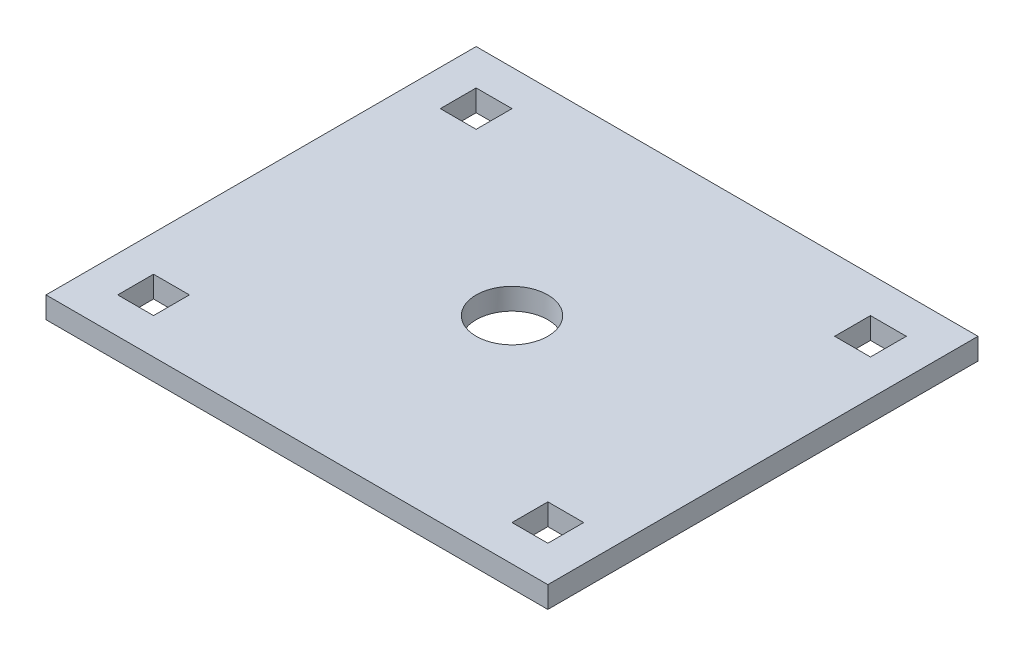
ISO-10303-21;
HEADER;
FILE_DESCRIPTION(('STEP AP214'),'2;1');
FILE_NAME('part.step','',(''),(''),'','','');
FILE_SCHEMA(('AUTOMOTIVE_DESIGN { 1 0 10303 214 1 1 1 1 }'));
ENDSEC;
DATA;
#1=APPLICATION_CONTEXT('core data for automotive mechanical design processes');
#2=APPLICATION_PROTOCOL_DEFINITION('international standard','automotive_design',2000,#1);
#3=PRODUCT_CONTEXT('',#1,'mechanical');
#4=PRODUCT('Part','Part','',(#3));
#5=PRODUCT_RELATED_PRODUCT_CATEGORY('part','',(#4));
#6=PRODUCT_DEFINITION_FORMATION('','',#4);
#7=PRODUCT_DEFINITION_CONTEXT('part definition',#1,'design');
#8=PRODUCT_DEFINITION('design','',#6,#7);
#9=PRODUCT_DEFINITION_SHAPE('','',#8);
#10=(LENGTH_UNIT() NAMED_UNIT(*) SI_UNIT(.MILLI.,.METRE.));
#11=(NAMED_UNIT(*) PLANE_ANGLE_UNIT() SI_UNIT($,.RADIAN.));
#12=(NAMED_UNIT(*) SI_UNIT($,.STERADIAN.) SOLID_ANGLE_UNIT());
#13=UNCERTAINTY_MEASURE_WITH_UNIT(LENGTH_MEASURE(1.E-05),#10,'distance_accuracy_value','');
#14=(GEOMETRIC_REPRESENTATION_CONTEXT(3) GLOBAL_UNCERTAINTY_ASSIGNED_CONTEXT((#13)) GLOBAL_UNIT_ASSIGNED_CONTEXT((#10,
#11,#12)) REPRESENTATION_CONTEXT('',''));
#15=CARTESIAN_POINT('',(0.,0.,0.));
#16=DIRECTION('',(0.,0.,1.));
#17=DIRECTION('',(1.,0.,0.));
#18=AXIS2_PLACEMENT_3D('',#15,#16,#17);
#19=CARTESIAN_POINT('',(88.9,7.62,76.2));
#20=DIRECTION('',(-1.,0.,0.));
#21=DIRECTION('',(0.,0.,1.));
#22=AXIS2_PLACEMENT_3D('',#19,#20,#21);
#23=PLANE('',#22);
#24=DIRECTION('',(0.,0.,-1.));
#25=VECTOR('',#24,1.);
#26=CARTESIAN_POINT('',(88.9,0.,76.2));
#27=LINE('',#26,#25);
#28=CARTESIAN_POINT('',(88.9,0.,76.2));
#29=VERTEX_POINT('',#28);
#30=CARTESIAN_POINT('',(88.9,0.,-76.2));
#31=VERTEX_POINT('',#30);
#32=EDGE_CURVE('E316',#29,#31,#27,.T.);
#33=ORIENTED_EDGE('',*,*,#32,.T.);
#34=DIRECTION('',(0.,-1.,0.));
#35=VECTOR('',#34,1.);
#36=CARTESIAN_POINT('',(88.9,7.62,-76.2));
#37=LINE('',#36,#35);
#38=CARTESIAN_POINT('',(88.9,7.62,-76.2));
#39=VERTEX_POINT('',#38);
#40=EDGE_CURVE('E11',#39,#31,#37,.T.);
#41=ORIENTED_EDGE('',*,*,#40,.F.);
#42=DIRECTION('',(0.,0.,-1.));
#43=VECTOR('',#42,1.);
#44=CARTESIAN_POINT('',(88.9,7.62,76.2));
#45=LINE('',#44,#43);
#46=CARTESIAN_POINT('',(88.9,7.62,76.2));
#47=VERTEX_POINT('',#46);
#48=EDGE_CURVE('E317',#47,#39,#45,.T.);
#49=ORIENTED_EDGE('',*,*,#48,.F.);
#50=DIRECTION('',(0.,-1.,0.));
#51=VECTOR('',#50,1.);
#52=CARTESIAN_POINT('',(88.9,7.62,76.2));
#53=LINE('',#52,#51);
#54=EDGE_CURVE('E327',#47,#29,#53,.T.);
#55=ORIENTED_EDGE('',*,*,#54,.T.);
#56=EDGE_LOOP('',(#33,#41,#49,#55));
#57=FACE_BOUND('',#56,.T.);
#58=ADVANCED_FACE('F39',(#57),#23,.F.);
#59=CARTESIAN_POINT('',(-88.9,7.62,-76.2));
#60=DIRECTION('',(0.,0.,1.));
#61=DIRECTION('',(1.,0.,0.));
#62=AXIS2_PLACEMENT_3D('',#59,#60,#61);
#63=PLANE('',#62);
#64=DIRECTION('',(-1.,0.,0.));
#65=VECTOR('',#64,1.);
#66=CARTESIAN_POINT('',(-88.9,0.,-76.2));
#67=LINE('',#66,#65);
#68=CARTESIAN_POINT('',(-88.9,0.,-76.2));
#69=VERTEX_POINT('',#68);
#70=EDGE_CURVE('E330',#31,#69,#67,.T.);
#71=ORIENTED_EDGE('',*,*,#70,.T.);
#72=DIRECTION('',(0.,-1.,0.));
#73=VECTOR('',#72,1.);
#74=CARTESIAN_POINT('',(-88.9,7.62,-76.2));
#75=LINE('',#74,#73);
#76=CARTESIAN_POINT('',(-88.9,7.62,-76.2));
#77=VERTEX_POINT('',#76);
#78=EDGE_CURVE('E46',#77,#69,#75,.T.);
#79=ORIENTED_EDGE('',*,*,#78,.F.);
#80=DIRECTION('',(-1.,0.,0.));
#81=VECTOR('',#80,1.);
#82=CARTESIAN_POINT('',(-88.9,7.62,-76.2));
#83=LINE('',#82,#81);
#84=EDGE_CURVE('E320',#39,#77,#83,.T.);
#85=ORIENTED_EDGE('',*,*,#84,.F.);
#86=ORIENTED_EDGE('',*,*,#40,.T.);
#87=EDGE_LOOP('',(#71,#79,#85,#86));
#88=FACE_BOUND('',#87,.T.);
#89=ADVANCED_FACE('F359',(#88),#63,.F.);
#90=CARTESIAN_POINT('',(-88.9,7.62,76.2));
#91=DIRECTION('',(1.,0.,0.));
#92=DIRECTION('',(0.,0.,-1.));
#93=AXIS2_PLACEMENT_3D('',#90,#91,#92);
#94=PLANE('',#93);
#95=DIRECTION('',(0.,0.,1.));
#96=VECTOR('',#95,1.);
#97=CARTESIAN_POINT('',(-88.9,0.,76.2));
#98=LINE('',#97,#96);
#99=CARTESIAN_POINT('',(-88.9,0.,76.2));
#100=VERTEX_POINT('',#99);
#101=EDGE_CURVE('E332',#69,#100,#98,.T.);
#102=ORIENTED_EDGE('',*,*,#101,.T.);
#103=DIRECTION('',(0.,-1.,0.));
#104=VECTOR('',#103,1.);
#105=CARTESIAN_POINT('',(-88.9,7.62,76.2));
#106=LINE('',#105,#104);
#107=CARTESIAN_POINT('',(-88.9,7.62,76.2));
#108=VERTEX_POINT('',#107);
#109=EDGE_CURVE('E337',#108,#100,#106,.T.);
#110=ORIENTED_EDGE('',*,*,#109,.F.);
#111=DIRECTION('',(0.,0.,1.));
#112=VECTOR('',#111,1.);
#113=CARTESIAN_POINT('',(-88.9,7.62,76.2));
#114=LINE('',#113,#112);
#115=EDGE_CURVE('E323',#77,#108,#114,.T.);
#116=ORIENTED_EDGE('',*,*,#115,.F.);
#117=ORIENTED_EDGE('',*,*,#78,.T.);
#118=EDGE_LOOP('',(#102,#110,#116,#117));
#119=FACE_BOUND('',#118,.T.);
#120=ADVANCED_FACE('F344',(#119),#94,.F.);
#121=CARTESIAN_POINT('',(-88.9,7.62,76.2));
#122=DIRECTION('',(0.,0.,-1.));
#123=DIRECTION('',(-1.,0.,0.));
#124=AXIS2_PLACEMENT_3D('',#121,#122,#123);
#125=PLANE('',#124);
#126=DIRECTION('',(1.,0.,0.));
#127=VECTOR('',#126,1.);
#128=CARTESIAN_POINT('',(-88.9,0.,76.2));
#129=LINE('',#128,#127);
#130=EDGE_CURVE('E321',#100,#29,#129,.T.);
#131=ORIENTED_EDGE('',*,*,#130,.T.);
#132=ORIENTED_EDGE('',*,*,#54,.F.);
#133=DIRECTION('',(1.,0.,0.));
#134=VECTOR('',#133,1.);
#135=CARTESIAN_POINT('',(-88.9,7.62,76.2));
#136=LINE('',#135,#134);
#137=EDGE_CURVE('E325',#108,#47,#136,.T.);
#138=ORIENTED_EDGE('',*,*,#137,.F.);
#139=ORIENTED_EDGE('',*,*,#109,.T.);
#140=EDGE_LOOP('',(#131,#132,#138,#139));
#141=FACE_BOUND('',#140,.T.);
#142=ADVANCED_FACE('F352',(#141),#125,.F.);
#143=CARTESIAN_POINT('',(0.,7.62,0.));
#144=DIRECTION('',(0.,-1.,0.));
#145=DIRECTION('',(0.,0.,-1.));
#146=AXIS2_PLACEMENT_3D('',#143,#144,#145);
#147=PLANE('',#146);
#148=DIRECTION('',(1.,0.,0.));
#149=VECTOR('',#148,1.);
#150=CARTESIAN_POINT('',(63.5,7.62,63.5));
#151=LINE('',#150,#149);
#152=CARTESIAN_POINT('',(63.5,7.62,63.5));
#153=VERTEX_POINT('',#152);
#154=CARTESIAN_POINT('',(76.2,7.62,63.5));
#155=VERTEX_POINT('',#154);
#156=EDGE_CURVE('E233',#153,#155,#151,.T.);
#157=ORIENTED_EDGE('',*,*,#156,.F.);
#158=DIRECTION('',(0.,0.,1.));
#159=VECTOR('',#158,1.);
#160=CARTESIAN_POINT('',(63.5,7.62,63.5));
#161=LINE('',#160,#159);
#162=CARTESIAN_POINT('',(63.5,7.62,50.8));
#163=VERTEX_POINT('',#162);
#164=EDGE_CURVE('E53',#163,#153,#161,.T.);
#165=ORIENTED_EDGE('',*,*,#164,.F.);
#166=DIRECTION('',(-1.,0.,0.));
#167=VECTOR('',#166,1.);
#168=CARTESIAN_POINT('',(63.5,7.62,50.8));
#169=LINE('',#168,#167);
#170=CARTESIAN_POINT('',(76.2,7.62,50.8));
#171=VERTEX_POINT('',#170);
#172=EDGE_CURVE('E222',#171,#163,#169,.T.);
#173=ORIENTED_EDGE('',*,*,#172,.F.);
#174=DIRECTION('',(0.,0.,-1.));
#175=VECTOR('',#174,1.);
#176=CARTESIAN_POINT('',(76.2,7.62,63.5));
#177=LINE('',#176,#175);
#178=EDGE_CURVE('E237',#155,#171,#177,.T.);
#179=ORIENTED_EDGE('',*,*,#178,.F.);
#180=EDGE_LOOP('',(#157,#165,#173,#179));
#181=FACE_BOUND('',#180,.T.);
#182=DIRECTION('',(1.,0.,0.));
#183=VECTOR('',#182,1.);
#184=CARTESIAN_POINT('',(-76.2,7.62,-50.8));
#185=LINE('',#184,#183);
#186=CARTESIAN_POINT('',(-76.2,7.62,-50.8));
#187=VERTEX_POINT('',#186);
#188=CARTESIAN_POINT('',(-63.5,7.62,-50.8000000000001));
#189=VERTEX_POINT('',#188);
#190=EDGE_CURVE('E265',#187,#189,#185,.T.);
#191=ORIENTED_EDGE('',*,*,#190,.F.);
#192=DIRECTION('',(0.,0.,1.));
#193=VECTOR('',#192,1.);
#194=CARTESIAN_POINT('',(-76.2,7.62,-63.5000000000001));
#195=LINE('',#194,#193);
#196=CARTESIAN_POINT('',(-76.2,7.62,-63.5000000000001));
#197=VERTEX_POINT('',#196);
#198=EDGE_CURVE('E61',#197,#187,#195,.T.);
#199=ORIENTED_EDGE('',*,*,#198,.F.);
#200=DIRECTION('',(-1.,0.,0.));
#201=VECTOR('',#200,1.);
#202=CARTESIAN_POINT('',(-76.2,7.62,-63.5000000000001));
#203=LINE('',#202,#201);
#204=CARTESIAN_POINT('',(-63.5,7.62,-63.5000000000001));
#205=VERTEX_POINT('',#204);
#206=EDGE_CURVE('E254',#205,#197,#203,.T.);
#207=ORIENTED_EDGE('',*,*,#206,.F.);
#208=DIRECTION('',(0.,0.,-1.));
#209=VECTOR('',#208,1.);
#210=CARTESIAN_POINT('',(-63.5,7.62,-63.5000000000001));
#211=LINE('',#210,#209);
#212=EDGE_CURVE('E268',#189,#205,#211,.T.);
#213=ORIENTED_EDGE('',*,*,#212,.F.);
#214=EDGE_LOOP('',(#191,#199,#207,#213));
#215=FACE_BOUND('',#214,.T.);
#216=DIRECTION('',(1.,0.,0.));
#217=VECTOR('',#216,1.);
#218=CARTESIAN_POINT('',(63.5,7.62,-50.8));
#219=LINE('',#218,#217);
#220=CARTESIAN_POINT('',(63.5,7.62,-50.8));
#221=VERTEX_POINT('',#220);
#222=CARTESIAN_POINT('',(76.2,7.62,-50.8));
#223=VERTEX_POINT('',#222);
#224=EDGE_CURVE('E209',#221,#223,#219,.T.);
#225=ORIENTED_EDGE('',*,*,#224,.F.);
#226=DIRECTION('',(0.,0.,1.));
#227=VECTOR('',#226,1.);
#228=CARTESIAN_POINT('',(63.5,7.62,-63.5));
#229=LINE('',#228,#227);
#230=CARTESIAN_POINT('',(63.5,7.62,-63.5));
#231=VERTEX_POINT('',#230);
#232=EDGE_CURVE('E182',#231,#221,#229,.T.);
#233=ORIENTED_EDGE('',*,*,#232,.F.);
#234=DIRECTION('',(-1.,0.,0.));
#235=VECTOR('',#234,1.);
#236=CARTESIAN_POINT('',(63.5,7.62,-63.5));
#237=LINE('',#236,#235);
#238=CARTESIAN_POINT('',(76.2,7.62,-63.5));
#239=VERTEX_POINT('',#238);
#240=EDGE_CURVE('E200',#239,#231,#237,.T.);
#241=ORIENTED_EDGE('',*,*,#240,.F.);
#242=DIRECTION('',(0.,0.,-1.));
#243=VECTOR('',#242,1.);
#244=CARTESIAN_POINT('',(76.2,7.62,-63.5));
#245=LINE('',#244,#243);
#246=EDGE_CURVE('E203',#223,#239,#245,.T.);
#247=ORIENTED_EDGE('',*,*,#246,.F.);
#248=EDGE_LOOP('',(#225,#233,#241,#247));
#249=FACE_BOUND('',#248,.T.);
#250=DIRECTION('',(1.,0.,0.));
#251=VECTOR('',#250,1.);
#252=CARTESIAN_POINT('',(-76.2,7.62,63.5));
#253=LINE('',#252,#251);
#254=CARTESIAN_POINT('',(-76.2,7.62,63.5));
#255=VERTEX_POINT('',#254);
#256=CARTESIAN_POINT('',(-63.5,7.62,63.4999999999999));
#257=VERTEX_POINT('',#256);
#258=EDGE_CURVE('E294',#255,#257,#253,.T.);
#259=ORIENTED_EDGE('',*,*,#258,.F.);
#260=DIRECTION('',(0.,0.,1.));
#261=VECTOR('',#260,1.);
#262=CARTESIAN_POINT('',(-76.2,7.62,63.5));
#263=LINE('',#262,#261);
#264=CARTESIAN_POINT('',(-76.2,7.62,50.8));
#265=VERTEX_POINT('',#264);
#266=EDGE_CURVE('E244',#265,#255,#263,.T.);
#267=ORIENTED_EDGE('',*,*,#266,.F.);
#268=DIRECTION('',(-1.,0.,0.));
#269=VECTOR('',#268,1.);
#270=CARTESIAN_POINT('',(-76.2,7.62,50.8));
#271=LINE('',#270,#269);
#272=CARTESIAN_POINT('',(-63.5,7.62,50.8));
#273=VERTEX_POINT('',#272);
#274=EDGE_CURVE('E283',#273,#265,#271,.T.);
#275=ORIENTED_EDGE('',*,*,#274,.F.);
#276=DIRECTION('',(0.,0.,-1.));
#277=VECTOR('',#276,1.);
#278=CARTESIAN_POINT('',(-63.5,7.62,63.4999999999999));
#279=LINE('',#278,#277);
#280=EDGE_CURVE('E297',#257,#273,#279,.T.);
#281=ORIENTED_EDGE('',*,*,#280,.F.);
#282=EDGE_LOOP('',(#259,#267,#275,#281));
#283=FACE_BOUND('',#282,.T.);
#284=CARTESIAN_POINT('',(0.,7.62,0.));
#285=DIRECTION('',(0.,1.,0.));
#286=DIRECTION('',(0.,0.,1.));
#287=AXIS2_PLACEMENT_3D('',#284,#285,#286);
#288=CIRCLE('',#287,12.7);
#289=CARTESIAN_POINT('',(0.,7.62,12.7));
#290=VERTEX_POINT('',#289);
#291=EDGE_CURVE('E304',#290,#290,#288,.T.);
#292=ORIENTED_EDGE('',*,*,#291,.F.);
#293=EDGE_LOOP('',(#292));
#294=FACE_BOUND('',#293,.T.);
#295=ORIENTED_EDGE('',*,*,#48,.T.);
#296=ORIENTED_EDGE('',*,*,#84,.T.);
#297=ORIENTED_EDGE('',*,*,#115,.T.);
#298=ORIENTED_EDGE('',*,*,#137,.T.);
#299=EDGE_LOOP('',(#295,#296,#297,#298));
#300=FACE_BOUND('',#299,.T.);
#301=ADVANCED_FACE('F358',(#181,#215,#249,#283,#294,#300),#147,.F.);
#302=CARTESIAN_POINT('',(0.,0.,0.));
#303=DIRECTION('',(0.,-1.,0.));
#304=DIRECTION('',(0.,0.,-1.));
#305=AXIS2_PLACEMENT_3D('',#302,#303,#304);
#306=PLANE('',#305);
#307=DIRECTION('',(0.,0.,1.));
#308=VECTOR('',#307,1.);
#309=CARTESIAN_POINT('',(63.5,0.,63.5));
#310=LINE('',#309,#308);
#311=CARTESIAN_POINT('',(63.5,0.,50.8));
#312=VERTEX_POINT('',#311);
#313=CARTESIAN_POINT('',(63.5,0.,63.5));
#314=VERTEX_POINT('',#313);
#315=EDGE_CURVE('E218',#312,#314,#310,.T.);
#316=ORIENTED_EDGE('',*,*,#315,.T.);
#317=DIRECTION('',(1.,0.,0.));
#318=VECTOR('',#317,1.);
#319=CARTESIAN_POINT('',(63.5,0.,63.5));
#320=LINE('',#319,#318);
#321=CARTESIAN_POINT('',(76.2,0.,63.5));
#322=VERTEX_POINT('',#321);
#323=EDGE_CURVE('E221',#314,#322,#320,.T.);
#324=ORIENTED_EDGE('',*,*,#323,.T.);
#325=DIRECTION('',(0.,0.,-1.));
#326=VECTOR('',#325,1.);
#327=CARTESIAN_POINT('',(76.2,0.,63.5));
#328=LINE('',#327,#326);
#329=CARTESIAN_POINT('',(76.2,0.,50.8));
#330=VERTEX_POINT('',#329);
#331=EDGE_CURVE('E225',#322,#330,#328,.T.);
#332=ORIENTED_EDGE('',*,*,#331,.T.);
#333=DIRECTION('',(-1.,0.,0.));
#334=VECTOR('',#333,1.);
#335=CARTESIAN_POINT('',(63.5,0.,50.8));
#336=LINE('',#335,#334);
#337=EDGE_CURVE('E228',#330,#312,#336,.T.);
#338=ORIENTED_EDGE('',*,*,#337,.T.);
#339=EDGE_LOOP('',(#316,#324,#332,#338));
#340=FACE_BOUND('',#339,.T.);
#341=DIRECTION('',(0.,0.,1.));
#342=VECTOR('',#341,1.);
#343=CARTESIAN_POINT('',(-76.2,0.,-63.5000000000001));
#344=LINE('',#343,#342);
#345=CARTESIAN_POINT('',(-76.2,0.,-63.5000000000001));
#346=VERTEX_POINT('',#345);
#347=CARTESIAN_POINT('',(-76.2,0.,-50.8));
#348=VERTEX_POINT('',#347);
#349=EDGE_CURVE('E250',#346,#348,#344,.T.);
#350=ORIENTED_EDGE('',*,*,#349,.T.);
#351=DIRECTION('',(1.,0.,0.));
#352=VECTOR('',#351,1.);
#353=CARTESIAN_POINT('',(-76.2,0.,-50.8));
#354=LINE('',#353,#352);
#355=CARTESIAN_POINT('',(-63.5,0.,-50.8000000000001));
#356=VERTEX_POINT('',#355);
#357=EDGE_CURVE('E253',#348,#356,#354,.T.);
#358=ORIENTED_EDGE('',*,*,#357,.T.);
#359=DIRECTION('',(0.,0.,-1.));
#360=VECTOR('',#359,1.);
#361=CARTESIAN_POINT('',(-63.5,0.,-63.5000000000001));
#362=LINE('',#361,#360);
#363=CARTESIAN_POINT('',(-63.5,0.,-63.5000000000001));
#364=VERTEX_POINT('',#363);
#365=EDGE_CURVE('E257',#356,#364,#362,.T.);
#366=ORIENTED_EDGE('',*,*,#365,.T.);
#367=DIRECTION('',(-1.,0.,0.));
#368=VECTOR('',#367,1.);
#369=CARTESIAN_POINT('',(-76.2,0.,-63.5000000000001));
#370=LINE('',#369,#368);
#371=EDGE_CURVE('E260',#364,#346,#370,.T.);
#372=ORIENTED_EDGE('',*,*,#371,.T.);
#373=EDGE_LOOP('',(#350,#358,#366,#372));
#374=FACE_BOUND('',#373,.T.);
#375=DIRECTION('',(0.,0.,1.));
#376=VECTOR('',#375,1.);
#377=CARTESIAN_POINT('',(63.5,0.,-63.5));
#378=LINE('',#377,#376);
#379=CARTESIAN_POINT('',(63.5,0.,-63.5));
#380=VERTEX_POINT('',#379);
#381=CARTESIAN_POINT('',(63.5,0.,-50.8));
#382=VERTEX_POINT('',#381);
#383=EDGE_CURVE('E179',#380,#382,#378,.T.);
#384=ORIENTED_EDGE('',*,*,#383,.T.);
#385=DIRECTION('',(1.,0.,0.));
#386=VECTOR('',#385,1.);
#387=CARTESIAN_POINT('',(63.5,0.,-50.8));
#388=LINE('',#387,#386);
#389=CARTESIAN_POINT('',(76.2,0.,-50.8));
#390=VERTEX_POINT('',#389);
#391=EDGE_CURVE('E191',#382,#390,#388,.T.);
#392=ORIENTED_EDGE('',*,*,#391,.T.);
#393=DIRECTION('',(0.,0.,-1.));
#394=VECTOR('',#393,1.);
#395=CARTESIAN_POINT('',(76.2,0.,-63.5));
#396=LINE('',#395,#394);
#397=CARTESIAN_POINT('',(76.2,0.,-63.5));
#398=VERTEX_POINT('',#397);
#399=EDGE_CURVE('E195',#390,#398,#396,.T.);
#400=ORIENTED_EDGE('',*,*,#399,.T.);
#401=DIRECTION('',(-1.,0.,0.));
#402=VECTOR('',#401,1.);
#403=CARTESIAN_POINT('',(63.5,0.,-63.5));
#404=LINE('',#403,#402);
#405=EDGE_CURVE('E187',#398,#380,#404,.T.);
#406=ORIENTED_EDGE('',*,*,#405,.T.);
#407=EDGE_LOOP('',(#384,#392,#400,#406));
#408=FACE_BOUND('',#407,.T.);
#409=DIRECTION('',(0.,0.,1.));
#410=VECTOR('',#409,1.);
#411=CARTESIAN_POINT('',(-76.2,0.,63.5));
#412=LINE('',#411,#410);
#413=CARTESIAN_POINT('',(-76.2,0.,50.8));
#414=VERTEX_POINT('',#413);
#415=CARTESIAN_POINT('',(-76.2,0.,63.5));
#416=VERTEX_POINT('',#415);
#417=EDGE_CURVE('E279',#414,#416,#412,.T.);
#418=ORIENTED_EDGE('',*,*,#417,.T.);
#419=DIRECTION('',(1.,0.,0.));
#420=VECTOR('',#419,1.);
#421=CARTESIAN_POINT('',(-76.2,0.,63.5));
#422=LINE('',#421,#420);
#423=CARTESIAN_POINT('',(-63.5,0.,63.4999999999999));
#424=VERTEX_POINT('',#423);
#425=EDGE_CURVE('E282',#416,#424,#422,.T.);
#426=ORIENTED_EDGE('',*,*,#425,.T.);
#427=DIRECTION('',(0.,0.,-1.));
#428=VECTOR('',#427,1.);
#429=CARTESIAN_POINT('',(-63.5,0.,63.4999999999999));
#430=LINE('',#429,#428);
#431=CARTESIAN_POINT('',(-63.5,0.,50.8));
#432=VERTEX_POINT('',#431);
#433=EDGE_CURVE('E286',#424,#432,#430,.T.);
#434=ORIENTED_EDGE('',*,*,#433,.T.);
#435=DIRECTION('',(-1.,0.,0.));
#436=VECTOR('',#435,1.);
#437=CARTESIAN_POINT('',(-76.2,0.,50.8));
#438=LINE('',#437,#436);
#439=EDGE_CURVE('E289',#432,#414,#438,.T.);
#440=ORIENTED_EDGE('',*,*,#439,.T.);
#441=EDGE_LOOP('',(#418,#426,#434,#440));
#442=FACE_BOUND('',#441,.T.);
#443=CARTESIAN_POINT('',(0.,0.,0.));
#444=DIRECTION('',(0.,-1.,0.));
#445=DIRECTION('',(0.,0.,-1.));
#446=AXIS2_PLACEMENT_3D('',#443,#444,#445);
#447=CIRCLE('',#446,12.7);
#448=CARTESIAN_POINT('',(0.,0.,-12.7));
#449=VERTEX_POINT('',#448);
#450=EDGE_CURVE('E313',#449,#449,#447,.F.);
#451=ORIENTED_EDGE('',*,*,#450,.T.);
#452=EDGE_LOOP('',(#451));
#453=FACE_BOUND('',#452,.T.);
#454=ORIENTED_EDGE('',*,*,#32,.F.);
#455=ORIENTED_EDGE('',*,*,#130,.F.);
#456=ORIENTED_EDGE('',*,*,#101,.F.);
#457=ORIENTED_EDGE('',*,*,#70,.F.);
#458=EDGE_LOOP('',(#454,#455,#456,#457));
#459=FACE_BOUND('',#458,.T.);
#460=ADVANCED_FACE('F197',(#340,#374,#408,#442,#453,#459),#306,.T.);
#461=CARTESIAN_POINT('',(0.,-35.9210244842766,0.));
#462=DIRECTION('',(0.,1.,0.));
#463=DIRECTION('',(0.,0.,1.));
#464=AXIS2_PLACEMENT_3D('',#461,#462,#463);
#465=CYLINDRICAL_SURFACE('',#464,12.7);
#466=ORIENTED_EDGE('',*,*,#291,.T.);
#467=EDGE_LOOP('',(#466));
#468=FACE_BOUND('',#467,.T.);
#469=ORIENTED_EDGE('',*,*,#450,.F.);
#470=EDGE_LOOP('',(#469));
#471=FACE_BOUND('',#470,.T.);
#472=ADVANCED_FACE('F371',(#468,#471),#465,.F.);
#473=CARTESIAN_POINT('',(-76.2,0.,63.5));
#474=DIRECTION('',(-1.,0.,0.));
#475=DIRECTION('',(0.,0.,1.));
#476=AXIS2_PLACEMENT_3D('',#473,#474,#475);
#477=PLANE('',#476);
#478=ORIENTED_EDGE('',*,*,#266,.T.);
#479=DIRECTION('',(0.,1.,0.));
#480=VECTOR('',#479,1.);
#481=CARTESIAN_POINT('',(-76.2,0.,63.5));
#482=LINE('',#481,#480);
#483=EDGE_CURVE('E292',#416,#255,#482,.T.);
#484=ORIENTED_EDGE('',*,*,#483,.F.);
#485=ORIENTED_EDGE('',*,*,#417,.F.);
#486=DIRECTION('',(0.,1.,0.));
#487=VECTOR('',#486,1.);
#488=CARTESIAN_POINT('',(-76.2,0.,50.8));
#489=LINE('',#488,#487);
#490=EDGE_CURVE('E302',#414,#265,#489,.T.);
#491=ORIENTED_EDGE('',*,*,#490,.T.);
#492=EDGE_LOOP('',(#478,#484,#485,#491));
#493=FACE_BOUND('',#492,.T.);
#494=ADVANCED_FACE('F378',(#493),#477,.F.);
#495=CARTESIAN_POINT('',(-76.2,0.,50.8));
#496=DIRECTION('',(0.,0.,-1.));
#497=DIRECTION('',(-1.,0.,0.));
#498=AXIS2_PLACEMENT_3D('',#495,#496,#497);
#499=PLANE('',#498);
#500=ORIENTED_EDGE('',*,*,#274,.T.);
#501=ORIENTED_EDGE('',*,*,#490,.F.);
#502=ORIENTED_EDGE('',*,*,#439,.F.);
#503=DIRECTION('',(0.,1.,0.));
#504=VECTOR('',#503,1.);
#505=CARTESIAN_POINT('',(-63.5,0.,50.8));
#506=LINE('',#505,#504);
#507=EDGE_CURVE('E305',#432,#273,#506,.T.);
#508=ORIENTED_EDGE('',*,*,#507,.T.);
#509=EDGE_LOOP('',(#500,#501,#502,#508));
#510=FACE_BOUND('',#509,.T.);
#511=ADVANCED_FACE('F382',(#510),#499,.F.);
#512=CARTESIAN_POINT('',(-63.5,0.,63.4999999999999));
#513=DIRECTION('',(1.,0.,0.));
#514=DIRECTION('',(0.,0.,-1.));
#515=AXIS2_PLACEMENT_3D('',#512,#513,#514);
#516=PLANE('',#515);
#517=ORIENTED_EDGE('',*,*,#280,.T.);
#518=ORIENTED_EDGE('',*,*,#507,.F.);
#519=ORIENTED_EDGE('',*,*,#433,.F.);
#520=DIRECTION('',(0.,1.,0.));
#521=VECTOR('',#520,1.);
#522=CARTESIAN_POINT('',(-63.5,0.,63.4999999999999));
#523=LINE('',#522,#521);
#524=EDGE_CURVE('E307',#424,#257,#523,.T.);
#525=ORIENTED_EDGE('',*,*,#524,.T.);
#526=EDGE_LOOP('',(#517,#518,#519,#525));
#527=FACE_BOUND('',#526,.T.);
#528=ADVANCED_FACE('F387',(#527),#516,.F.);
#529=CARTESIAN_POINT('',(-76.2,0.,63.5));
#530=DIRECTION('',(0.,0.,1.));
#531=DIRECTION('',(1.,0.,0.));
#532=AXIS2_PLACEMENT_3D('',#529,#530,#531);
#533=PLANE('',#532);
#534=ORIENTED_EDGE('',*,*,#258,.T.);
#535=ORIENTED_EDGE('',*,*,#524,.F.);
#536=ORIENTED_EDGE('',*,*,#425,.F.);
#537=ORIENTED_EDGE('',*,*,#483,.T.);
#538=EDGE_LOOP('',(#534,#535,#536,#537));
#539=FACE_BOUND('',#538,.T.);
#540=ADVANCED_FACE('F384',(#539),#533,.F.);
#541=CARTESIAN_POINT('',(63.5,0.,-63.5));
#542=DIRECTION('',(-1.,0.,0.));
#543=DIRECTION('',(0.,0.,1.));
#544=AXIS2_PLACEMENT_3D('',#541,#542,#543);
#545=PLANE('',#544);
#546=ORIENTED_EDGE('',*,*,#232,.T.);
#547=DIRECTION('',(0.,1.,0.));
#548=VECTOR('',#547,1.);
#549=CARTESIAN_POINT('',(63.5,0.,-50.8));
#550=LINE('',#549,#548);
#551=EDGE_CURVE('E175',#382,#221,#550,.T.);
#552=ORIENTED_EDGE('',*,*,#551,.F.);
#553=ORIENTED_EDGE('',*,*,#383,.F.);
#554=DIRECTION('',(0.,1.,0.));
#555=VECTOR('',#554,1.);
#556=CARTESIAN_POINT('',(63.5,0.,-63.5));
#557=LINE('',#556,#555);
#558=EDGE_CURVE('E213',#380,#231,#557,.T.);
#559=ORIENTED_EDGE('',*,*,#558,.T.);
#560=EDGE_LOOP('',(#546,#552,#553,#559));
#561=FACE_BOUND('',#560,.T.);
#562=ADVANCED_FACE('F177',(#561),#545,.F.);
#563=CARTESIAN_POINT('',(63.5,0.,-63.5));
#564=DIRECTION('',(0.,0.,-1.));
#565=DIRECTION('',(-1.,0.,0.));
#566=AXIS2_PLACEMENT_3D('',#563,#564,#565);
#567=PLANE('',#566);
#568=ORIENTED_EDGE('',*,*,#240,.T.);
#569=ORIENTED_EDGE('',*,*,#558,.F.);
#570=ORIENTED_EDGE('',*,*,#405,.F.);
#571=DIRECTION('',(0.,1.,0.));
#572=VECTOR('',#571,1.);
#573=CARTESIAN_POINT('',(76.2,0.,-63.5));
#574=LINE('',#573,#572);
#575=EDGE_CURVE('E215',#398,#239,#574,.T.);
#576=ORIENTED_EDGE('',*,*,#575,.T.);
#577=EDGE_LOOP('',(#568,#569,#570,#576));
#578=FACE_BOUND('',#577,.T.);
#579=ADVANCED_FACE('F427',(#578),#567,.F.);
#580=CARTESIAN_POINT('',(76.2,0.,-63.5));
#581=DIRECTION('',(1.,0.,0.));
#582=DIRECTION('',(0.,0.,-1.));
#583=AXIS2_PLACEMENT_3D('',#580,#581,#582);
#584=PLANE('',#583);
#585=ORIENTED_EDGE('',*,*,#246,.T.);
#586=ORIENTED_EDGE('',*,*,#575,.F.);
#587=ORIENTED_EDGE('',*,*,#399,.F.);
#588=DIRECTION('',(0.,1.,0.));
#589=VECTOR('',#588,1.);
#590=CARTESIAN_POINT('',(76.2,0.,-50.8));
#591=LINE('',#590,#589);
#592=EDGE_CURVE('E186',#390,#223,#591,.T.);
#593=ORIENTED_EDGE('',*,*,#592,.T.);
#594=EDGE_LOOP('',(#585,#586,#587,#593));
#595=FACE_BOUND('',#594,.T.);
#596=ADVANCED_FACE('F430',(#595),#584,.F.);
#597=CARTESIAN_POINT('',(63.5,0.,-50.8));
#598=DIRECTION('',(0.,0.,1.));
#599=DIRECTION('',(1.,0.,0.));
#600=AXIS2_PLACEMENT_3D('',#597,#598,#599);
#601=PLANE('',#600);
#602=ORIENTED_EDGE('',*,*,#224,.T.);
#603=ORIENTED_EDGE('',*,*,#592,.F.);
#604=ORIENTED_EDGE('',*,*,#391,.F.);
#605=ORIENTED_EDGE('',*,*,#551,.T.);
#606=EDGE_LOOP('',(#602,#603,#604,#605));
#607=FACE_BOUND('',#606,.T.);
#608=ADVANCED_FACE('F192',(#607),#601,.F.);
#609=CARTESIAN_POINT('',(-76.2,0.,-63.5000000000001));
#610=DIRECTION('',(-1.,0.,0.));
#611=DIRECTION('',(0.,0.,1.));
#612=AXIS2_PLACEMENT_3D('',#609,#610,#611);
#613=PLANE('',#612);
#614=ORIENTED_EDGE('',*,*,#198,.T.);
#615=DIRECTION('',(0.,1.,0.));
#616=VECTOR('',#615,1.);
#617=CARTESIAN_POINT('',(-76.2,0.,-50.8));
#618=LINE('',#617,#616);
#619=EDGE_CURVE('E263',#348,#187,#618,.T.);
#620=ORIENTED_EDGE('',*,*,#619,.F.);
#621=ORIENTED_EDGE('',*,*,#349,.F.);
#622=DIRECTION('',(0.,1.,0.));
#623=VECTOR('',#622,1.);
#624=CARTESIAN_POINT('',(-76.2,0.,-63.5000000000001));
#625=LINE('',#624,#623);
#626=EDGE_CURVE('E234',#346,#197,#625,.T.);
#627=ORIENTED_EDGE('',*,*,#626,.T.);
#628=EDGE_LOOP('',(#614,#620,#621,#627));
#629=FACE_BOUND('',#628,.T.);
#630=ADVANCED_FACE('F395',(#629),#613,.F.);
#631=CARTESIAN_POINT('',(-76.2,0.,-63.5000000000001));
#632=DIRECTION('',(0.,0.,-1.));
#633=DIRECTION('',(-1.,0.,0.));
#634=AXIS2_PLACEMENT_3D('',#631,#632,#633);
#635=PLANE('',#634);
#636=ORIENTED_EDGE('',*,*,#206,.T.);
#637=ORIENTED_EDGE('',*,*,#626,.F.);
#638=ORIENTED_EDGE('',*,*,#371,.F.);
#639=DIRECTION('',(0.,1.,0.));
#640=VECTOR('',#639,1.);
#641=CARTESIAN_POINT('',(-63.5,0.,-63.5000000000001));
#642=LINE('',#641,#640);
#643=EDGE_CURVE('E274',#364,#205,#642,.T.);
#644=ORIENTED_EDGE('',*,*,#643,.T.);
#645=EDGE_LOOP('',(#636,#637,#638,#644));
#646=FACE_BOUND('',#645,.T.);
#647=ADVANCED_FACE('F398',(#646),#635,.F.);
#648=CARTESIAN_POINT('',(-63.5,0.,-63.5000000000001));
#649=DIRECTION('',(1.,0.,0.));
#650=DIRECTION('',(0.,0.,-1.));
#651=AXIS2_PLACEMENT_3D('',#648,#649,#650);
#652=PLANE('',#651);
#653=ORIENTED_EDGE('',*,*,#212,.T.);
#654=ORIENTED_EDGE('',*,*,#643,.F.);
#655=ORIENTED_EDGE('',*,*,#365,.F.);
#656=DIRECTION('',(0.,1.,0.));
#657=VECTOR('',#656,1.);
#658=CARTESIAN_POINT('',(-63.5,0.,-50.8000000000001));
#659=LINE('',#658,#657);
#660=EDGE_CURVE('E276',#356,#189,#659,.T.);
#661=ORIENTED_EDGE('',*,*,#660,.T.);
#662=EDGE_LOOP('',(#653,#654,#655,#661));
#663=FACE_BOUND('',#662,.T.);
#664=ADVANCED_FACE('F403',(#663),#652,.F.);
#665=CARTESIAN_POINT('',(-76.2,0.,-50.8));
#666=DIRECTION('',(0.,0.,1.));
#667=DIRECTION('',(1.,0.,0.));
#668=AXIS2_PLACEMENT_3D('',#665,#666,#667);
#669=PLANE('',#668);
#670=ORIENTED_EDGE('',*,*,#190,.T.);
#671=ORIENTED_EDGE('',*,*,#660,.F.);
#672=ORIENTED_EDGE('',*,*,#357,.F.);
#673=ORIENTED_EDGE('',*,*,#619,.T.);
#674=EDGE_LOOP('',(#670,#671,#672,#673));
#675=FACE_BOUND('',#674,.T.);
#676=ADVANCED_FACE('F399',(#675),#669,.F.);
#677=CARTESIAN_POINT('',(63.5,0.,63.5));
#678=DIRECTION('',(-1.,0.,0.));
#679=DIRECTION('',(0.,0.,1.));
#680=AXIS2_PLACEMENT_3D('',#677,#678,#679);
#681=PLANE('',#680);
#682=ORIENTED_EDGE('',*,*,#164,.T.);
#683=DIRECTION('',(0.,1.,0.));
#684=VECTOR('',#683,1.);
#685=CARTESIAN_POINT('',(63.5,0.,63.5));
#686=LINE('',#685,#684);
#687=EDGE_CURVE('E231',#314,#153,#686,.T.);
#688=ORIENTED_EDGE('',*,*,#687,.F.);
#689=ORIENTED_EDGE('',*,*,#315,.F.);
#690=DIRECTION('',(0.,1.,0.));
#691=VECTOR('',#690,1.);
#692=CARTESIAN_POINT('',(63.5,0.,50.8));
#693=LINE('',#692,#691);
#694=EDGE_CURVE('E242',#312,#163,#693,.T.);
#695=ORIENTED_EDGE('',*,*,#694,.T.);
#696=EDGE_LOOP('',(#682,#688,#689,#695));
#697=FACE_BOUND('',#696,.T.);
#698=ADVANCED_FACE('F402',(#697),#681,.F.);
#699=CARTESIAN_POINT('',(63.5,0.,50.8));
#700=DIRECTION('',(0.,0.,-1.));
#701=DIRECTION('',(-1.,0.,0.));
#702=AXIS2_PLACEMENT_3D('',#699,#700,#701);
#703=PLANE('',#702);
#704=ORIENTED_EDGE('',*,*,#172,.T.);
#705=ORIENTED_EDGE('',*,*,#694,.F.);
#706=ORIENTED_EDGE('',*,*,#337,.F.);
#707=DIRECTION('',(0.,1.,0.));
#708=VECTOR('',#707,1.);
#709=CARTESIAN_POINT('',(76.2,0.,50.8));
#710=LINE('',#709,#708);
#711=EDGE_CURVE('E245',#330,#171,#710,.T.);
#712=ORIENTED_EDGE('',*,*,#711,.T.);
#713=EDGE_LOOP('',(#704,#705,#706,#712));
#714=FACE_BOUND('',#713,.T.);
#715=ADVANCED_FACE('F413',(#714),#703,.F.);
#716=CARTESIAN_POINT('',(76.2,0.,63.5));
#717=DIRECTION('',(1.,0.,0.));
#718=DIRECTION('',(0.,0.,-1.));
#719=AXIS2_PLACEMENT_3D('',#716,#717,#718);
#720=PLANE('',#719);
#721=ORIENTED_EDGE('',*,*,#178,.T.);
#722=ORIENTED_EDGE('',*,*,#711,.F.);
#723=ORIENTED_EDGE('',*,*,#331,.F.);
#724=DIRECTION('',(0.,1.,0.));
#725=VECTOR('',#724,1.);
#726=CARTESIAN_POINT('',(76.2,0.,63.5));
#727=LINE('',#726,#725);
#728=EDGE_CURVE('E247',#322,#155,#727,.T.);
#729=ORIENTED_EDGE('',*,*,#728,.T.);
#730=EDGE_LOOP('',(#721,#722,#723,#729));
#731=FACE_BOUND('',#730,.T.);
#732=ADVANCED_FACE('F417',(#731),#720,.F.);
#733=CARTESIAN_POINT('',(63.5,0.,63.5));
#734=DIRECTION('',(0.,0.,1.));
#735=DIRECTION('',(1.,0.,0.));
#736=AXIS2_PLACEMENT_3D('',#733,#734,#735);
#737=PLANE('',#736);
#738=ORIENTED_EDGE('',*,*,#156,.T.);
#739=ORIENTED_EDGE('',*,*,#728,.F.);
#740=ORIENTED_EDGE('',*,*,#323,.F.);
#741=ORIENTED_EDGE('',*,*,#687,.T.);
#742=EDGE_LOOP('',(#738,#739,#740,#741));
#743=FACE_BOUND('',#742,.T.);
#744=ADVANCED_FACE('F414',(#743),#737,.F.);
#745=CLOSED_SHELL('',(#58,#89,#120,#142,#301,#460,#472,#494,#511,#528,#540,#562,#579,#596,#608,
#630,#647,#664,#676,#698,#715,#732,#744));
#746=MANIFOLD_SOLID_BREP('B2',#745);
#747=ADVANCED_BREP_SHAPE_REPRESENTATION('',(#18,#746),#14);
#748=SHAPE_DEFINITION_REPRESENTATION(#9,#747);
ENDSEC;
END-ISO-10303-21;
